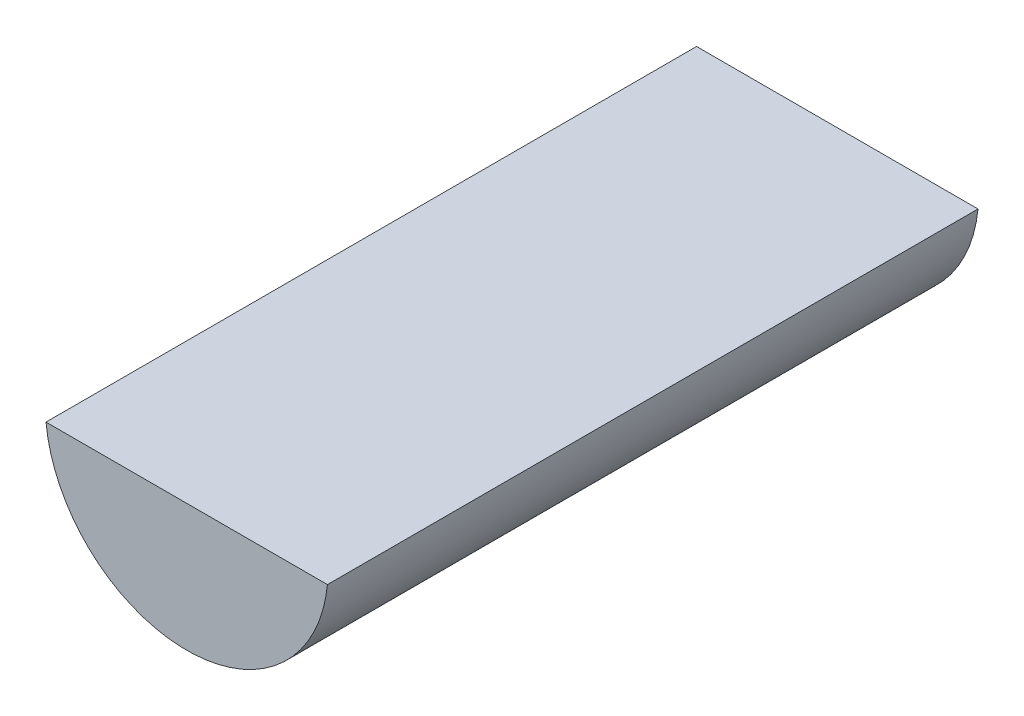
ISO-10303-21;
HEADER;
FILE_DESCRIPTION(('STEP AP214'),'2;1');
FILE_NAME('part.step','',(''),(''),'','','');
FILE_SCHEMA(('AUTOMOTIVE_DESIGN { 1 0 10303 214 1 1 1 1 }'));
ENDSEC;
DATA;
#1=APPLICATION_CONTEXT('core data for automotive mechanical design processes');
#2=APPLICATION_PROTOCOL_DEFINITION('international standard','automotive_design',2000,#1);
#3=PRODUCT_CONTEXT('',#1,'mechanical');
#4=PRODUCT('Part','Part','',(#3));
#5=PRODUCT_RELATED_PRODUCT_CATEGORY('part','',(#4));
#6=PRODUCT_DEFINITION_FORMATION('','',#4);
#7=PRODUCT_DEFINITION_CONTEXT('part definition',#1,'design');
#8=PRODUCT_DEFINITION('design','',#6,#7);
#9=PRODUCT_DEFINITION_SHAPE('','',#8);
#10=(LENGTH_UNIT() NAMED_UNIT(*) SI_UNIT(.MILLI.,.METRE.));
#11=(NAMED_UNIT(*) PLANE_ANGLE_UNIT() SI_UNIT($,.RADIAN.));
#12=(NAMED_UNIT(*) SI_UNIT($,.STERADIAN.) SOLID_ANGLE_UNIT());
#13=UNCERTAINTY_MEASURE_WITH_UNIT(LENGTH_MEASURE(1.E-05),#10,'distance_accuracy_value','');
#14=(GEOMETRIC_REPRESENTATION_CONTEXT(3) GLOBAL_UNCERTAINTY_ASSIGNED_CONTEXT((#13)) GLOBAL_UNIT_ASSIGNED_CONTEXT((#10,
#11,#12)) REPRESENTATION_CONTEXT('',''));
#15=CARTESIAN_POINT('',(0.,0.,0.));
#16=DIRECTION('',(0.,0.,1.));
#17=DIRECTION('',(1.,0.,0.));
#18=AXIS2_PLACEMENT_3D('',#15,#16,#17);
#19=CARTESIAN_POINT('',(0.,0.,230.));
#20=DIRECTION('',(0.,0.,-1.));
#21=DIRECTION('',(-1.,0.,0.));
#22=AXIS2_PLACEMENT_3D('',#19,#20,#21);
#23=CYLINDRICAL_SURFACE('',#22,50.);
#24=CARTESIAN_POINT('',(0.,0.,0.));
#25=DIRECTION('',(0.,0.,1.));
#26=DIRECTION('',(1.,0.,0.));
#27=AXIS2_PLACEMENT_3D('',#24,#25,#26);
#28=CIRCLE('',#27,50.);
#29=CARTESIAN_POINT('',(-49.749371855331,-5.00000000000001,0.));
#30=VERTEX_POINT('',#29);
#31=CARTESIAN_POINT('',(49.749371855331,-5.00000000000001,0.));
#32=VERTEX_POINT('',#31);
#33=EDGE_CURVE('E76',#30,#32,#28,.T.);
#34=ORIENTED_EDGE('',*,*,#33,.T.);
#35=DIRECTION('',(0.,0.,-1.));
#36=VECTOR('',#35,1.);
#37=CARTESIAN_POINT('',(49.749371855331,-5.00000000000001,230.));
#38=LINE('',#37,#36);
#39=CARTESIAN_POINT('',(49.749371855331,-5.00000000000001,230.));
#40=VERTEX_POINT('',#39);
#41=EDGE_CURVE('E11',#40,#32,#38,.T.);
#42=ORIENTED_EDGE('',*,*,#41,.F.);
#43=CARTESIAN_POINT('',(0.,0.,230.));
#44=DIRECTION('',(0.,0.,1.));
#45=DIRECTION('',(1.,0.,0.));
#46=AXIS2_PLACEMENT_3D('',#43,#44,#45);
#47=CIRCLE('',#46,50.);
#48=CARTESIAN_POINT('',(-49.749371855331,-5.00000000000001,230.));
#49=VERTEX_POINT('',#48);
#50=EDGE_CURVE('E75',#49,#40,#47,.T.);
#51=ORIENTED_EDGE('',*,*,#50,.F.);
#52=DIRECTION('',(0.,0.,-1.));
#53=VECTOR('',#52,1.);
#54=CARTESIAN_POINT('',(-49.749371855331,-5.00000000000001,230.));
#55=LINE('',#54,#53);
#56=EDGE_CURVE('E52',#49,#30,#55,.T.);
#57=ORIENTED_EDGE('',*,*,#56,.T.);
#58=EDGE_LOOP('',(#34,#42,#51,#57));
#59=FACE_BOUND('',#58,.T.);
#60=ADVANCED_FACE('F43',(#59),#23,.T.);
#61=CARTESIAN_POINT('',(-49.749371855331,-5.00000000000001,230.));
#62=DIRECTION('',(0.,-1.,0.));
#63=DIRECTION('',(0.,0.,-1.));
#64=AXIS2_PLACEMENT_3D('',#61,#62,#63);
#65=PLANE('',#64);
#66=DIRECTION('',(-1.,0.,0.));
#67=VECTOR('',#66,1.);
#68=CARTESIAN_POINT('',(-49.749371855331,-5.00000000000001,0.));
#69=LINE('',#68,#67);
#70=EDGE_CURVE('E67',#32,#30,#69,.T.);
#71=ORIENTED_EDGE('',*,*,#70,.T.);
#72=ORIENTED_EDGE('',*,*,#56,.F.);
#73=DIRECTION('',(-1.,0.,0.));
#74=VECTOR('',#73,1.);
#75=CARTESIAN_POINT('',(-49.749371855331,-5.00000000000001,230.));
#76=LINE('',#75,#74);
#77=EDGE_CURVE('E59',#40,#49,#76,.T.);
#78=ORIENTED_EDGE('',*,*,#77,.F.);
#79=ORIENTED_EDGE('',*,*,#41,.T.);
#80=EDGE_LOOP('',(#71,#72,#78,#79));
#81=FACE_BOUND('',#80,.T.);
#82=ADVANCED_FACE('F70',(#81),#65,.F.);
#83=CARTESIAN_POINT('',(0.,0.,230.));
#84=DIRECTION('',(0.,0.,1.));
#85=DIRECTION('',(1.,0.,0.));
#86=AXIS2_PLACEMENT_3D('',#83,#84,#85);
#87=PLANE('',#86);
#88=ORIENTED_EDGE('',*,*,#50,.T.);
#89=ORIENTED_EDGE('',*,*,#77,.T.);
#90=EDGE_LOOP('',(#88,#89));
#91=FACE_BOUND('',#90,.T.);
#92=ADVANCED_FACE('F87',(#91),#87,.T.);
#93=CARTESIAN_POINT('',(0.,0.,0.));
#94=DIRECTION('',(0.,0.,1.));
#95=DIRECTION('',(1.,0.,0.));
#96=AXIS2_PLACEMENT_3D('',#93,#94,#95);
#97=PLANE('',#96);
#98=ORIENTED_EDGE('',*,*,#33,.F.);
#99=ORIENTED_EDGE('',*,*,#70,.F.);
#100=EDGE_LOOP('',(#98,#99));
#101=FACE_BOUND('',#100,.T.);
#102=ADVANCED_FACE('F80',(#101),#97,.F.);
#103=CLOSED_SHELL('',(#60,#82,#92,#102));
#104=MANIFOLD_SOLID_BREP('B2',#103);
#105=ADVANCED_BREP_SHAPE_REPRESENTATION('',(#18,#104),#14);
#106=SHAPE_DEFINITION_REPRESENTATION(#9,#105);
ENDSEC;
END-ISO-10303-21;
